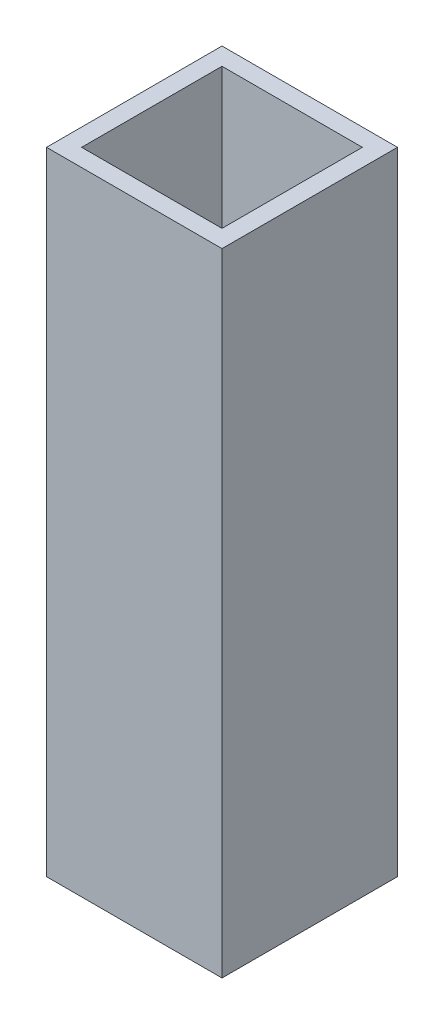
ISO-10303-21;
HEADER;
FILE_DESCRIPTION(('STEP AP214'),'2;1');
FILE_NAME('part.step','',(''),(''),'','','');
FILE_SCHEMA(('AUTOMOTIVE_DESIGN { 1 0 10303 214 1 1 1 1 }'));
ENDSEC;
DATA;
#1=APPLICATION_CONTEXT('core data for automotive mechanical design processes');
#2=APPLICATION_PROTOCOL_DEFINITION('international standard','automotive_design',2000,#1);
#3=PRODUCT_CONTEXT('',#1,'mechanical');
#4=PRODUCT('Part','Part','',(#3));
#5=PRODUCT_RELATED_PRODUCT_CATEGORY('part','',(#4));
#6=PRODUCT_DEFINITION_FORMATION('','',#4);
#7=PRODUCT_DEFINITION_CONTEXT('part definition',#1,'design');
#8=PRODUCT_DEFINITION('design','',#6,#7);
#9=PRODUCT_DEFINITION_SHAPE('','',#8);
#10=(LENGTH_UNIT() NAMED_UNIT(*) SI_UNIT(.MILLI.,.METRE.));
#11=(NAMED_UNIT(*) PLANE_ANGLE_UNIT() SI_UNIT($,.RADIAN.));
#12=(NAMED_UNIT(*) SI_UNIT($,.STERADIAN.) SOLID_ANGLE_UNIT());
#13=UNCERTAINTY_MEASURE_WITH_UNIT(LENGTH_MEASURE(1.E-05),#10,'distance_accuracy_value','');
#14=(GEOMETRIC_REPRESENTATION_CONTEXT(3) GLOBAL_UNCERTAINTY_ASSIGNED_CONTEXT((#13)) GLOBAL_UNIT_ASSIGNED_CONTEXT((#10,
#11,#12)) REPRESENTATION_CONTEXT('',''));
#15=CARTESIAN_POINT('',(0.,0.,0.));
#16=DIRECTION('',(0.,0.,1.));
#17=DIRECTION('',(1.,0.,0.));
#18=AXIS2_PLACEMENT_3D('',#15,#16,#17);
#19=CARTESIAN_POINT('',(6.25,45.,6.25));
#20=DIRECTION('',(-1.,0.,0.));
#21=DIRECTION('',(0.,0.,1.));
#22=AXIS2_PLACEMENT_3D('',#19,#20,#21);
#23=PLANE('',#22);
#24=DIRECTION('',(0.,0.,-1.));
#25=VECTOR('',#24,1.);
#26=CARTESIAN_POINT('',(6.25,0.,6.25));
#27=LINE('',#26,#25);
#28=CARTESIAN_POINT('',(6.25,0.,6.25));
#29=VERTEX_POINT('',#28);
#30=CARTESIAN_POINT('',(6.25,0.,-6.25));
#31=VERTEX_POINT('',#30);
#32=EDGE_CURVE('E151',#29,#31,#27,.T.);
#33=ORIENTED_EDGE('',*,*,#32,.T.);
#34=DIRECTION('',(0.,-1.,0.));
#35=VECTOR('',#34,1.);
#36=CARTESIAN_POINT('',(6.25,45.,-6.25));
#37=LINE('',#36,#35);
#38=CARTESIAN_POINT('',(6.25,45.,-6.25));
#39=VERTEX_POINT('',#38);
#40=EDGE_CURVE('E11',#39,#31,#37,.T.);
#41=ORIENTED_EDGE('',*,*,#40,.F.);
#42=DIRECTION('',(0.,0.,-1.));
#43=VECTOR('',#42,1.);
#44=CARTESIAN_POINT('',(6.25,45.,6.25));
#45=LINE('',#44,#43);
#46=CARTESIAN_POINT('',(6.25,45.,6.25));
#47=VERTEX_POINT('',#46);
#48=EDGE_CURVE('E154',#47,#39,#45,.T.);
#49=ORIENTED_EDGE('',*,*,#48,.F.);
#50=DIRECTION('',(0.,-1.,0.));
#51=VECTOR('',#50,1.);
#52=CARTESIAN_POINT('',(6.25,45.,6.25));
#53=LINE('',#52,#51);
#54=EDGE_CURVE('E161',#47,#29,#53,.T.);
#55=ORIENTED_EDGE('',*,*,#54,.T.);
#56=EDGE_LOOP('',(#33,#41,#49,#55));
#57=FACE_BOUND('',#56,.T.);
#58=ADVANCED_FACE('F43',(#57),#23,.F.);
#59=CARTESIAN_POINT('',(-6.25,45.,-6.25));
#60=DIRECTION('',(0.,0.,1.));
#61=DIRECTION('',(1.,0.,0.));
#62=AXIS2_PLACEMENT_3D('',#59,#60,#61);
#63=PLANE('',#62);
#64=DIRECTION('',(-1.,0.,0.));
#65=VECTOR('',#64,1.);
#66=CARTESIAN_POINT('',(-6.25,0.,-6.25));
#67=LINE('',#66,#65);
#68=CARTESIAN_POINT('',(-6.25,0.,-6.25));
#69=VERTEX_POINT('',#68);
#70=EDGE_CURVE('E163',#31,#69,#67,.T.);
#71=ORIENTED_EDGE('',*,*,#70,.T.);
#72=DIRECTION('',(0.,-1.,0.));
#73=VECTOR('',#72,1.);
#74=CARTESIAN_POINT('',(-6.25,45.,-6.25));
#75=LINE('',#74,#73);
#76=CARTESIAN_POINT('',(-6.25,45.,-6.25));
#77=VERTEX_POINT('',#76);
#78=EDGE_CURVE('E49',#77,#69,#75,.T.);
#79=ORIENTED_EDGE('',*,*,#78,.F.);
#80=DIRECTION('',(-1.,0.,0.));
#81=VECTOR('',#80,1.);
#82=CARTESIAN_POINT('',(-6.25,45.,-6.25));
#83=LINE('',#82,#81);
#84=EDGE_CURVE('E94',#39,#77,#83,.T.);
#85=ORIENTED_EDGE('',*,*,#84,.F.);
#86=ORIENTED_EDGE('',*,*,#40,.T.);
#87=EDGE_LOOP('',(#71,#79,#85,#86));
#88=FACE_BOUND('',#87,.T.);
#89=ADVANCED_FACE('F193',(#88),#63,.F.);
#90=CARTESIAN_POINT('',(-6.25,45.,6.25));
#91=DIRECTION('',(1.,0.,0.));
#92=DIRECTION('',(0.,0.,-1.));
#93=AXIS2_PLACEMENT_3D('',#90,#91,#92);
#94=PLANE('',#93);
#95=DIRECTION('',(0.,0.,1.));
#96=VECTOR('',#95,1.);
#97=CARTESIAN_POINT('',(-6.25,0.,6.25));
#98=LINE('',#97,#96);
#99=CARTESIAN_POINT('',(-6.25,0.,6.25));
#100=VERTEX_POINT('',#99);
#101=EDGE_CURVE('E167',#69,#100,#98,.T.);
#102=ORIENTED_EDGE('',*,*,#101,.T.);
#103=DIRECTION('',(0.,-1.,0.));
#104=VECTOR('',#103,1.);
#105=CARTESIAN_POINT('',(-6.25,45.,6.25));
#106=LINE('',#105,#104);
#107=CARTESIAN_POINT('',(-6.25,45.,6.25));
#108=VERTEX_POINT('',#107);
#109=EDGE_CURVE('E168',#108,#100,#106,.T.);
#110=ORIENTED_EDGE('',*,*,#109,.F.);
#111=DIRECTION('',(0.,0.,1.));
#112=VECTOR('',#111,1.);
#113=CARTESIAN_POINT('',(-6.25,45.,6.25));
#114=LINE('',#113,#112);
#115=EDGE_CURVE('E158',#77,#108,#114,.T.);
#116=ORIENTED_EDGE('',*,*,#115,.F.);
#117=ORIENTED_EDGE('',*,*,#78,.T.);
#118=EDGE_LOOP('',(#102,#110,#116,#117));
#119=FACE_BOUND('',#118,.T.);
#120=ADVANCED_FACE('F175',(#119),#94,.F.);
#121=CARTESIAN_POINT('',(-6.25,45.,6.25));
#122=DIRECTION('',(0.,0.,-1.));
#123=DIRECTION('',(-1.,0.,0.));
#124=AXIS2_PLACEMENT_3D('',#121,#122,#123);
#125=PLANE('',#124);
#126=DIRECTION('',(1.,0.,0.));
#127=VECTOR('',#126,1.);
#128=CARTESIAN_POINT('',(-6.25,0.,6.25));
#129=LINE('',#128,#127);
#130=EDGE_CURVE('E87',#100,#29,#129,.T.);
#131=ORIENTED_EDGE('',*,*,#130,.T.);
#132=ORIENTED_EDGE('',*,*,#54,.F.);
#133=DIRECTION('',(1.,0.,0.));
#134=VECTOR('',#133,1.);
#135=CARTESIAN_POINT('',(-6.25,45.,6.25));
#136=LINE('',#135,#134);
#137=EDGE_CURVE('E69',#108,#47,#136,.T.);
#138=ORIENTED_EDGE('',*,*,#137,.F.);
#139=ORIENTED_EDGE('',*,*,#109,.T.);
#140=EDGE_LOOP('',(#131,#132,#138,#139));
#141=FACE_BOUND('',#140,.T.);
#142=ADVANCED_FACE('F181',(#141),#125,.F.);
#143=CARTESIAN_POINT('',(0.,45.,0.));
#144=DIRECTION('',(0.,-1.,0.));
#145=DIRECTION('',(0.,0.,-1.));
#146=AXIS2_PLACEMENT_3D('',#143,#144,#145);
#147=PLANE('',#146);
#148=DIRECTION('',(1.,0.,0.));
#149=VECTOR('',#148,1.);
#150=CARTESIAN_POINT('',(-5.,45.,5.));
#151=LINE('',#150,#149);
#152=CARTESIAN_POINT('',(-5.,45.,5.));
#153=VERTEX_POINT('',#152);
#154=CARTESIAN_POINT('',(5.,45.,5.));
#155=VERTEX_POINT('',#154);
#156=EDGE_CURVE('E144',#153,#155,#151,.T.);
#157=ORIENTED_EDGE('',*,*,#156,.F.);
#158=DIRECTION('',(0.,0.,1.));
#159=VECTOR('',#158,1.);
#160=CARTESIAN_POINT('',(-5.,45.,-5.));
#161=LINE('',#160,#159);
#162=CARTESIAN_POINT('',(-5.,45.,-5.));
#163=VERTEX_POINT('',#162);
#164=EDGE_CURVE('E60',#163,#153,#161,.T.);
#165=ORIENTED_EDGE('',*,*,#164,.F.);
#166=DIRECTION('',(-1.,0.,0.));
#167=VECTOR('',#166,1.);
#168=CARTESIAN_POINT('',(5.,45.,-5.));
#169=LINE('',#168,#167);
#170=CARTESIAN_POINT('',(5.,45.,-5.));
#171=VERTEX_POINT('',#170);
#172=EDGE_CURVE('E139',#171,#163,#169,.T.);
#173=ORIENTED_EDGE('',*,*,#172,.F.);
#174=DIRECTION('',(0.,0.,-1.));
#175=VECTOR('',#174,1.);
#176=CARTESIAN_POINT('',(5.,45.,5.));
#177=LINE('',#176,#175);
#178=EDGE_CURVE('E138',#155,#171,#177,.T.);
#179=ORIENTED_EDGE('',*,*,#178,.F.);
#180=EDGE_LOOP('',(#157,#165,#173,#179));
#181=FACE_BOUND('',#180,.T.);
#182=ORIENTED_EDGE('',*,*,#48,.T.);
#183=ORIENTED_EDGE('',*,*,#84,.T.);
#184=ORIENTED_EDGE('',*,*,#115,.T.);
#185=ORIENTED_EDGE('',*,*,#137,.T.);
#186=EDGE_LOOP('',(#182,#183,#184,#185));
#187=FACE_BOUND('',#186,.T.);
#188=ADVANCED_FACE('F183',(#181,#187),#147,.F.);
#189=CARTESIAN_POINT('',(0.,0.,0.));
#190=DIRECTION('',(0.,-1.,0.));
#191=DIRECTION('',(0.,0.,-1.));
#192=AXIS2_PLACEMENT_3D('',#189,#190,#191);
#193=PLANE('',#192);
#194=ORIENTED_EDGE('',*,*,#32,.F.);
#195=ORIENTED_EDGE('',*,*,#130,.F.);
#196=ORIENTED_EDGE('',*,*,#101,.F.);
#197=ORIENTED_EDGE('',*,*,#70,.F.);
#198=EDGE_LOOP('',(#194,#195,#196,#197));
#199=FACE_BOUND('',#198,.T.);
#200=ADVANCED_FACE('F178',(#199),#193,.T.);
#201=CARTESIAN_POINT('',(-5.,1.24999999999999,-5.));
#202=DIRECTION('',(-1.,0.,0.));
#203=DIRECTION('',(0.,0.,1.));
#204=AXIS2_PLACEMENT_3D('',#201,#202,#203);
#205=PLANE('',#204);
#206=ORIENTED_EDGE('',*,*,#164,.T.);
#207=DIRECTION('',(0.,1.,0.));
#208=VECTOR('',#207,1.);
#209=CARTESIAN_POINT('',(-5.,1.24999999999999,5.));
#210=LINE('',#209,#208);
#211=CARTESIAN_POINT('',(-5.,1.24999999999999,5.));
#212=VERTEX_POINT('',#211);
#213=EDGE_CURVE('E111',#212,#153,#210,.T.);
#214=ORIENTED_EDGE('',*,*,#213,.F.);
#215=DIRECTION('',(0.,0.,1.));
#216=VECTOR('',#215,1.);
#217=CARTESIAN_POINT('',(-5.,1.24999999999999,-5.));
#218=LINE('',#217,#216);
#219=CARTESIAN_POINT('',(-5.,1.24999999999999,-5.));
#220=VERTEX_POINT('',#219);
#221=EDGE_CURVE('E119',#220,#212,#218,.T.);
#222=ORIENTED_EDGE('',*,*,#221,.F.);
#223=DIRECTION('',(0.,1.,0.));
#224=VECTOR('',#223,1.);
#225=CARTESIAN_POINT('',(-5.,1.24999999999999,-5.));
#226=LINE('',#225,#224);
#227=EDGE_CURVE('E149',#220,#163,#226,.T.);
#228=ORIENTED_EDGE('',*,*,#227,.T.);
#229=EDGE_LOOP('',(#206,#214,#222,#228));
#230=FACE_BOUND('',#229,.T.);
#231=ADVANCED_FACE('F116',(#230),#205,.F.);
#232=CARTESIAN_POINT('',(5.,1.24999999999999,-5.));
#233=DIRECTION('',(0.,0.,-1.));
#234=DIRECTION('',(-1.,0.,0.));
#235=AXIS2_PLACEMENT_3D('',#232,#233,#234);
#236=PLANE('',#235);
#237=ORIENTED_EDGE('',*,*,#172,.T.);
#238=ORIENTED_EDGE('',*,*,#227,.F.);
#239=DIRECTION('',(-1.,0.,0.));
#240=VECTOR('',#239,1.);
#241=CARTESIAN_POINT('',(5.,1.24999999999999,-5.));
#242=LINE('',#241,#240);
#243=CARTESIAN_POINT('',(5.,1.24999999999999,-5.));
#244=VERTEX_POINT('',#243);
#245=EDGE_CURVE('E123',#244,#220,#242,.T.);
#246=ORIENTED_EDGE('',*,*,#245,.F.);
#247=DIRECTION('',(0.,1.,0.));
#248=VECTOR('',#247,1.);
#249=CARTESIAN_POINT('',(5.,1.24999999999999,-5.));
#250=LINE('',#249,#248);
#251=EDGE_CURVE('E155',#244,#171,#250,.T.);
#252=ORIENTED_EDGE('',*,*,#251,.T.);
#253=EDGE_LOOP('',(#237,#238,#246,#252));
#254=FACE_BOUND('',#253,.T.);
#255=ADVANCED_FACE('F233',(#254),#236,.F.);
#256=CARTESIAN_POINT('',(5.,1.24999999999999,5.));
#257=DIRECTION('',(1.,0.,0.));
#258=DIRECTION('',(0.,0.,-1.));
#259=AXIS2_PLACEMENT_3D('',#256,#257,#258);
#260=PLANE('',#259);
#261=ORIENTED_EDGE('',*,*,#178,.T.);
#262=ORIENTED_EDGE('',*,*,#251,.F.);
#263=DIRECTION('',(0.,0.,-1.));
#264=VECTOR('',#263,1.);
#265=CARTESIAN_POINT('',(5.,1.24999999999999,5.));
#266=LINE('',#265,#264);
#267=CARTESIAN_POINT('',(5.,1.24999999999999,5.));
#268=VERTEX_POINT('',#267);
#269=EDGE_CURVE('E132',#268,#244,#266,.T.);
#270=ORIENTED_EDGE('',*,*,#269,.F.);
#271=DIRECTION('',(0.,1.,0.));
#272=VECTOR('',#271,1.);
#273=CARTESIAN_POINT('',(5.,1.24999999999999,5.));
#274=LINE('',#273,#272);
#275=EDGE_CURVE('E125',#268,#155,#274,.T.);
#276=ORIENTED_EDGE('',*,*,#275,.T.);
#277=EDGE_LOOP('',(#261,#262,#270,#276));
#278=FACE_BOUND('',#277,.T.);
#279=ADVANCED_FACE('F244',(#278),#260,.F.);
#280=CARTESIAN_POINT('',(-5.,1.24999999999999,5.));
#281=DIRECTION('',(0.,0.,1.));
#282=DIRECTION('',(1.,0.,0.));
#283=AXIS2_PLACEMENT_3D('',#280,#281,#282);
#284=PLANE('',#283);
#285=ORIENTED_EDGE('',*,*,#156,.T.);
#286=ORIENTED_EDGE('',*,*,#275,.F.);
#287=DIRECTION('',(1.,0.,0.));
#288=VECTOR('',#287,1.);
#289=CARTESIAN_POINT('',(-5.,1.24999999999999,5.));
#290=LINE('',#289,#288);
#291=EDGE_CURVE('E130',#212,#268,#290,.T.);
#292=ORIENTED_EDGE('',*,*,#291,.F.);
#293=ORIENTED_EDGE('',*,*,#213,.T.);
#294=EDGE_LOOP('',(#285,#286,#292,#293));
#295=FACE_BOUND('',#294,.T.);
#296=ADVANCED_FACE('F126',(#295),#284,.F.);
#297=CARTESIAN_POINT('',(0.,1.24999999999999,0.));
#298=DIRECTION('',(0.,1.,0.));
#299=DIRECTION('',(0.,0.,1.));
#300=AXIS2_PLACEMENT_3D('',#297,#298,#299);
#301=PLANE('',#300);
#302=ORIENTED_EDGE('',*,*,#221,.T.);
#303=ORIENTED_EDGE('',*,*,#291,.T.);
#304=ORIENTED_EDGE('',*,*,#269,.T.);
#305=ORIENTED_EDGE('',*,*,#245,.T.);
#306=EDGE_LOOP('',(#302,#303,#304,#305));
#307=FACE_BOUND('',#306,.T.);
#308=ADVANCED_FACE('F133',(#307),#301,.T.);
#309=CLOSED_SHELL('',(#58,#89,#120,#142,#188,#200,#231,#255,#279,#296,#308));
#310=MANIFOLD_SOLID_BREP('B2',#309);
#311=ADVANCED_BREP_SHAPE_REPRESENTATION('',(#18,#310),#14);
#312=SHAPE_DEFINITION_REPRESENTATION(#9,#311);
ENDSEC;
END-ISO-10303-21;
